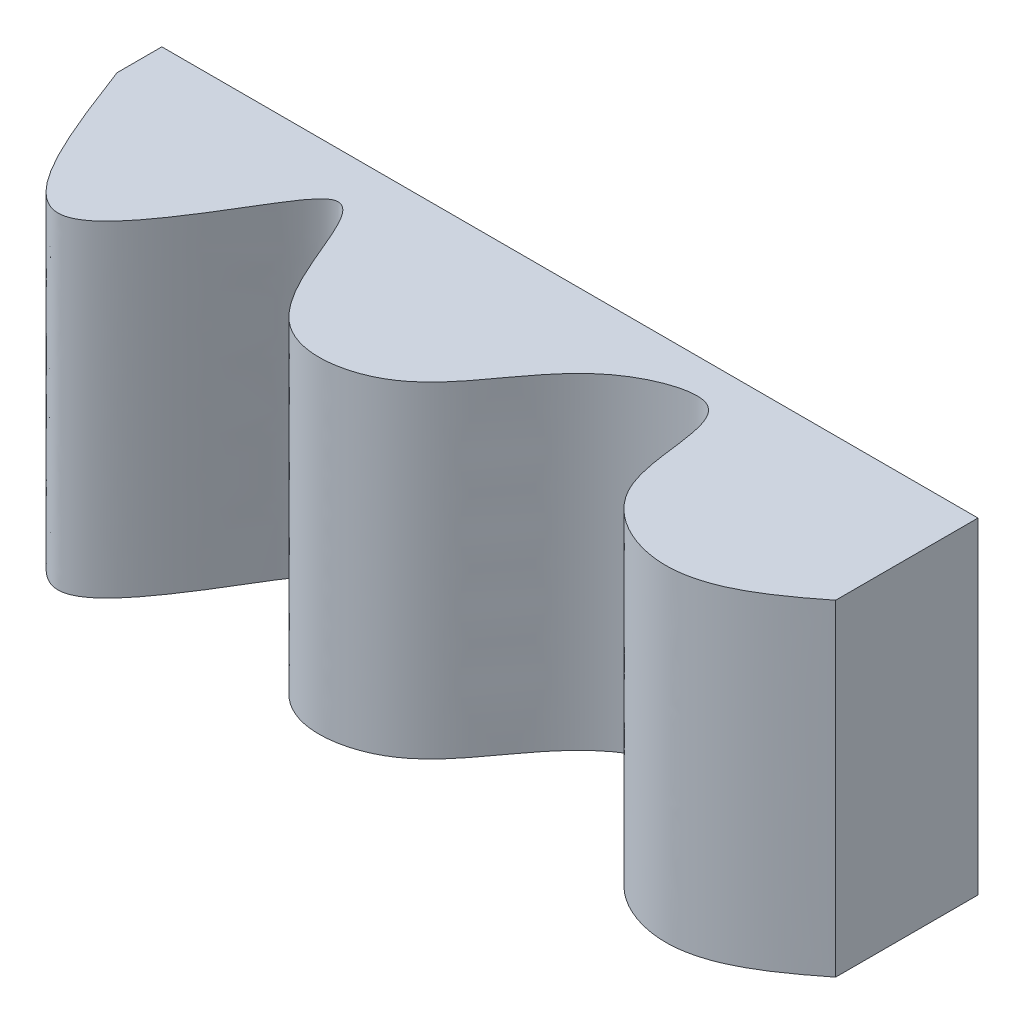
ISO-10303-21;
HEADER;
FILE_DESCRIPTION(('STEP AP214'),'2;1');
FILE_NAME('part.step','',(''),(''),'','','');
FILE_SCHEMA(('AUTOMOTIVE_DESIGN { 1 0 10303 214 1 1 1 1 }'));
ENDSEC;
DATA;
#1=APPLICATION_CONTEXT('core data for automotive mechanical design processes');
#2=APPLICATION_PROTOCOL_DEFINITION('international standard','automotive_design',2000,#1);
#3=PRODUCT_CONTEXT('',#1,'mechanical');
#4=PRODUCT('Part','Part','',(#3));
#5=PRODUCT_RELATED_PRODUCT_CATEGORY('part','',(#4));
#6=PRODUCT_DEFINITION_FORMATION('','',#4);
#7=PRODUCT_DEFINITION_CONTEXT('part definition',#1,'design');
#8=PRODUCT_DEFINITION('design','',#6,#7);
#9=PRODUCT_DEFINITION_SHAPE('','',#8);
#10=(LENGTH_UNIT() NAMED_UNIT(*) SI_UNIT(.MILLI.,.METRE.));
#11=(NAMED_UNIT(*) PLANE_ANGLE_UNIT() SI_UNIT($,.RADIAN.));
#12=(NAMED_UNIT(*) SI_UNIT($,.STERADIAN.) SOLID_ANGLE_UNIT());
#13=UNCERTAINTY_MEASURE_WITH_UNIT(LENGTH_MEASURE(1.E-05),#10,'distance_accuracy_value','');
#14=(GEOMETRIC_REPRESENTATION_CONTEXT(3) GLOBAL_UNCERTAINTY_ASSIGNED_CONTEXT((#13)) GLOBAL_UNIT_ASSIGNED_CONTEXT((#10,
#11,#12)) REPRESENTATION_CONTEXT('',''));
#15=CARTESIAN_POINT('',(0.,0.,0.));
#16=DIRECTION('',(0.,0.,1.));
#17=DIRECTION('',(1.,0.,0.));
#18=AXIS2_PLACEMENT_3D('',#15,#16,#17);
#19=CARTESIAN_POINT('',(0.,0.,31.75));
#20=DIRECTION('',(1.,0.,0.));
#21=DIRECTION('',(0.,0.,-1.));
#22=AXIS2_PLACEMENT_3D('',#19,#20,#21);
#23=PLANE('',#22);
#24=DIRECTION('',(0.,0.,-1.));
#25=VECTOR('',#24,1.);
#26=CARTESIAN_POINT('',(0.,0.,31.75));
#27=LINE('',#26,#25);
#28=CARTESIAN_POINT('',(0.,0.,6.97268829231925));
#29=VERTEX_POINT('',#28);
#30=CARTESIAN_POINT('',(0.,0.,0.));
#31=VERTEX_POINT('',#30);
#32=EDGE_CURVE('E47',#29,#31,#27,.T.);
#33=ORIENTED_EDGE('',*,*,#32,.F.);
#34=DIRECTION('',(0.,-1.,0.));
#35=VECTOR('',#34,1.);
#36=CARTESIAN_POINT('',(0.,63.1522450340861,6.97268829231925));
#37=LINE('',#36,#35);
#38=CARTESIAN_POINT('',(0.,50.8,6.97268829231925));
#39=VERTEX_POINT('',#38);
#40=EDGE_CURVE('E78',#39,#29,#37,.T.);
#41=ORIENTED_EDGE('',*,*,#40,.F.);
#42=DIRECTION('',(0.,0.,-1.));
#43=VECTOR('',#42,1.);
#44=CARTESIAN_POINT('',(0.,50.8,31.75));
#45=LINE('',#44,#43);
#46=CARTESIAN_POINT('',(0.,50.8,0.));
#47=VERTEX_POINT('',#46);
#48=EDGE_CURVE('E61',#39,#47,#45,.T.);
#49=ORIENTED_EDGE('',*,*,#48,.T.);
#50=DIRECTION('',(0.,-1.,0.));
#51=VECTOR('',#50,1.);
#52=CARTESIAN_POINT('',(0.,0.,0.));
#53=LINE('',#52,#51);
#54=EDGE_CURVE('E92',#47,#31,#53,.T.);
#55=ORIENTED_EDGE('',*,*,#54,.T.);
#56=EDGE_LOOP('',(#33,#41,#49,#55));
#57=FACE_BOUND('',#56,.T.);
#58=ADVANCED_FACE('F38',(#57),#23,.F.);
#59=CARTESIAN_POINT('',(0.,0.,31.75));
#60=DIRECTION('',(0.,1.,0.));
#61=DIRECTION('',(0.,0.,1.));
#62=AXIS2_PLACEMENT_3D('',#59,#60,#61);
#63=PLANE('',#62);
#64=DIRECTION('',(0.,0.,-1.));
#65=VECTOR('',#64,1.);
#66=CARTESIAN_POINT('',(127.,0.,31.75));
#67=LINE('',#66,#65);
#68=CARTESIAN_POINT('',(126.999999990192,0.,22.1532631194405));
#69=VERTEX_POINT('',#68);
#70=CARTESIAN_POINT('',(127.,0.,0.));
#71=VERTEX_POINT('',#70);
#72=EDGE_CURVE('E89',#69,#71,#67,.T.);
#73=ORIENTED_EDGE('',*,*,#72,.F.);
#74=CARTESIAN_POINT('',(0.,0.,6.97268829231925));
#75=CARTESIAN_POINT('',(4.56921241488977,0.,19.0143691342473));
#76=CARTESIAN_POINT('',(12.7481181485041,0.,40.5690187188137));
#77=CARTESIAN_POINT('',(26.0618934869177,0.,18.5355883599709));
#78=CARTESIAN_POINT('',(37.5032188609215,0.,-0.376757501144906));
#79=CARTESIAN_POINT('',(41.4945009332085,0.,31.7014422857119));
#80=CARTESIAN_POINT('',(68.7270223363572,0.,28.6324265119162));
#81=CARTESIAN_POINT('',(72.8330993173661,0.,9.71518697681186));
#82=CARTESIAN_POINT('',(95.4786724252947,0.,2.4582604363301));
#83=CARTESIAN_POINT('',(91.5992652312652,0.,24.5254475195242));
#84=CARTESIAN_POINT('',(111.588978821747,0.,34.4567165968398));
#85=CARTESIAN_POINT('',(122.342038283541,0.,25.8762937239784));
#86=CARTESIAN_POINT('',(128.941461595824,0.,20.6102721849367));
#87=B_SPLINE_CURVE_WITH_KNOTS('',3,(#74,#75,#76,#77,#78,#79,#80,#81,#82,#83,#84,#85,#86),
.UNSPECIFIED.,.F.,.F.,(4,1,1,1,1,1,1,1,1,1,4),(0.,0.146501059019123,0.262237392966767,
0.305080700826341,0.432785565639603,0.506884257187901,0.656936027302639,0.70525283364515,
0.800854462954142,0.877779370198127,1.),.UNSPECIFIED.);
#88=EDGE_CURVE('E81',#29,#69,#87,.T.);
#89=ORIENTED_EDGE('',*,*,#88,.F.);
#90=ORIENTED_EDGE('',*,*,#32,.T.);
#91=DIRECTION('',(1.,0.,0.));
#92=VECTOR('',#91,1.);
#93=CARTESIAN_POINT('',(0.,0.,0.));
#94=LINE('',#93,#92);
#95=EDGE_CURVE('E103',#31,#71,#94,.T.);
#96=ORIENTED_EDGE('',*,*,#95,.T.);
#97=EDGE_LOOP('',(#73,#89,#90,#96));
#98=FACE_BOUND('',#97,.T.);
#99=ADVANCED_FACE('F86',(#98),#63,.F.);
#100=CARTESIAN_POINT('',(127.,0.,31.75));
#101=DIRECTION('',(-1.,0.,0.));
#102=DIRECTION('',(0.,0.,1.));
#103=AXIS2_PLACEMENT_3D('',#100,#101,#102);
#104=PLANE('',#103);
#105=DIRECTION('',(0.,0.,-1.));
#106=VECTOR('',#105,1.);
#107=CARTESIAN_POINT('',(127.,50.8,31.75));
#108=LINE('',#107,#106);
#109=CARTESIAN_POINT('',(127.,50.8,22.1532631194405));
#110=VERTEX_POINT('',#109);
#111=CARTESIAN_POINT('',(127.,50.8,0.));
#112=VERTEX_POINT('',#111);
#113=EDGE_CURVE('E93',#110,#112,#108,.T.);
#114=ORIENTED_EDGE('',*,*,#113,.F.);
#115=DIRECTION('',(0.,-1.,0.));
#116=VECTOR('',#115,1.);
#117=CARTESIAN_POINT('',(127.000000000001,63.1522450340861,22.153263111707));
#118=LINE('',#117,#116);
#119=EDGE_CURVE('E54',#110,#69,#118,.T.);
#120=ORIENTED_EDGE('',*,*,#119,.T.);
#121=ORIENTED_EDGE('',*,*,#72,.T.);
#122=DIRECTION('',(0.,1.,0.));
#123=VECTOR('',#122,1.);
#124=CARTESIAN_POINT('',(127.,0.,0.));
#125=LINE('',#124,#123);
#126=EDGE_CURVE('E100',#71,#112,#125,.T.);
#127=ORIENTED_EDGE('',*,*,#126,.T.);
#128=EDGE_LOOP('',(#114,#120,#121,#127));
#129=FACE_BOUND('',#128,.T.);
#130=ADVANCED_FACE('F125',(#129),#104,.F.);
#131=CARTESIAN_POINT('',(0.,50.8,31.75));
#132=DIRECTION('',(0.,-1.,0.));
#133=DIRECTION('',(0.,0.,-1.));
#134=AXIS2_PLACEMENT_3D('',#131,#132,#133);
#135=PLANE('',#134);
#136=ORIENTED_EDGE('',*,*,#48,.F.);
#137=CARTESIAN_POINT('',(0.,50.8,6.97268829231925));
#138=CARTESIAN_POINT('',(4.56921241488977,50.8,19.0143691342473));
#139=CARTESIAN_POINT('',(12.7481181485041,50.8,40.5690187188137));
#140=CARTESIAN_POINT('',(26.0618934869177,50.8,18.5355883599709));
#141=CARTESIAN_POINT('',(37.5032188609215,50.8,-0.376757501144906));
#142=CARTESIAN_POINT('',(41.4945009332085,50.8,31.7014422857119));
#143=CARTESIAN_POINT('',(68.7270223363572,50.8,28.6324265119162));
#144=CARTESIAN_POINT('',(72.8330993173661,50.8,9.71518697681186));
#145=CARTESIAN_POINT('',(95.4786724252947,50.8,2.4582604363301));
#146=CARTESIAN_POINT('',(91.5992652312652,50.8,24.5254475195242));
#147=CARTESIAN_POINT('',(111.588978821747,50.8,34.4567165968398));
#148=CARTESIAN_POINT('',(122.342038283541,50.8,25.8762937239784));
#149=CARTESIAN_POINT('',(128.941461595824,50.8,20.6102721849367));
#150=B_SPLINE_CURVE_WITH_KNOTS('',3,(#137,#138,#139,#140,#141,#142,#143,#144,#145,#146,#147,
#148,#149),.UNSPECIFIED.,.F.,.F.,(4,1,1,1,1,1,1,1,1,1,4),(0.,0.146501059019123,
0.262237392966767,0.305080700826341,0.432785565639603,0.506884257187901,0.656936027302639,
0.70525283364515,0.800854462954142,0.877779370198127,1.),.UNSPECIFIED.);
#151=EDGE_CURVE('E11',#39,#110,#150,.T.);
#152=ORIENTED_EDGE('',*,*,#151,.T.);
#153=ORIENTED_EDGE('',*,*,#113,.T.);
#154=DIRECTION('',(-1.,0.,0.));
#155=VECTOR('',#154,1.);
#156=CARTESIAN_POINT('',(0.,50.8,0.));
#157=LINE('',#156,#155);
#158=EDGE_CURVE('E98',#112,#47,#157,.T.);
#159=ORIENTED_EDGE('',*,*,#158,.T.);
#160=EDGE_LOOP('',(#136,#152,#153,#159));
#161=FACE_BOUND('',#160,.T.);
#162=ADVANCED_FACE('F121',(#161),#135,.F.);
#163=CARTESIAN_POINT('',(0.,50.8,0.));
#164=DIRECTION('',(0.,0.,-1.));
#165=DIRECTION('',(-1.,0.,0.));
#166=AXIS2_PLACEMENT_3D('',#163,#164,#165);
#167=PLANE('',#166);
#168=ORIENTED_EDGE('',*,*,#54,.F.);
#169=ORIENTED_EDGE('',*,*,#158,.F.);
#170=ORIENTED_EDGE('',*,*,#126,.F.);
#171=ORIENTED_EDGE('',*,*,#95,.F.);
#172=EDGE_LOOP('',(#168,#169,#170,#171));
#173=FACE_BOUND('',#172,.T.);
#174=ADVANCED_FACE('F118',(#173),#167,.T.);
#175=CARTESIAN_POINT('',(0.,63.1522450340861,6.97268829231925));
#176=CARTESIAN_POINT('',(4.56921241488977,63.1522450340861,19.0143691342473));
#177=CARTESIAN_POINT('',(12.7481181485041,63.1522450340861,40.5690187188137));
#178=CARTESIAN_POINT('',(26.0618934869177,63.1522450340861,18.5355883599709));
#179=CARTESIAN_POINT('',(37.5032188609215,63.1522450340861,-0.376757501144906));
#180=CARTESIAN_POINT('',(41.4945009332085,63.1522450340861,31.7014422857119));
#181=CARTESIAN_POINT('',(68.7270223363572,63.1522450340861,28.6324265119162));
#182=CARTESIAN_POINT('',(72.8330993173661,63.1522450340861,9.71518697681186));
#183=CARTESIAN_POINT('',(95.4786724252947,63.1522450340861,2.4582604363301));
#184=CARTESIAN_POINT('',(91.5992652312652,63.1522450340861,24.5254475195242));
#185=CARTESIAN_POINT('',(111.588978821747,63.1522450340861,34.4567165968398));
#186=CARTESIAN_POINT('',(122.342038283541,63.1522450340861,25.8762937239784));
#187=CARTESIAN_POINT('',(128.941461595824,63.1522450340861,20.6102721849367));
#188=B_SPLINE_CURVE_WITH_KNOTS('',3,(#175,#176,#177,#178,#179,#180,#181,#182,#183,#184,#185,
#186,#187),.UNSPECIFIED.,.F.,.F.,(4,1,1,1,1,1,1,1,1,1,4),(0.,0.146501059019123,
0.262237392966767,0.305080700826341,0.432785565639603,0.506884257187901,0.656936027302639,
0.70525283364515,0.800854462954142,0.877779370198127,1.),.UNSPECIFIED.);
#189=DIRECTION('',(0.,-1.,0.));
#190=VECTOR('',#189,1.);
#191=SURFACE_OF_LINEAR_EXTRUSION('',#188,#190);
#192=ORIENTED_EDGE('',*,*,#151,.F.);
#193=ORIENTED_EDGE('',*,*,#40,.T.);
#194=ORIENTED_EDGE('',*,*,#88,.T.);
#195=ORIENTED_EDGE('',*,*,#119,.F.);
#196=EDGE_LOOP('',(#192,#193,#194,#195));
#197=FACE_BOUND('',#196,.T.);
#198=ADVANCED_FACE('F80',(#197),#191,.F.);
#199=CLOSED_SHELL('',(#58,#99,#130,#162,#174,#198));
#200=MANIFOLD_SOLID_BREP('B2',#199);
#201=ADVANCED_BREP_SHAPE_REPRESENTATION('',(#18,#200),#14);
#202=SHAPE_DEFINITION_REPRESENTATION(#9,#201);
ENDSEC;
END-ISO-10303-21;
